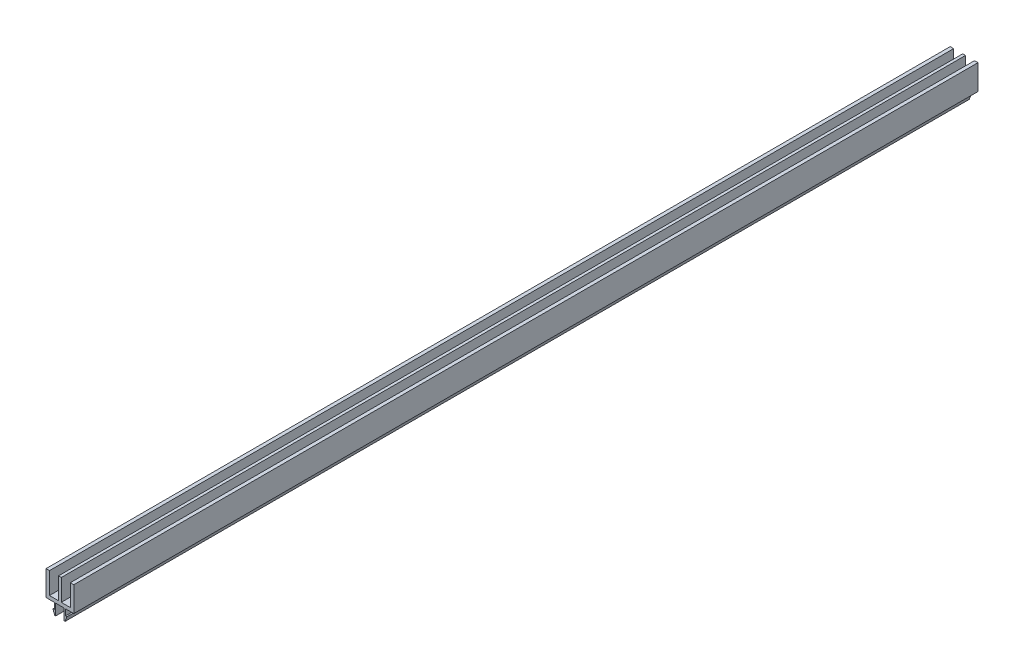
ISO-10303-21;
HEADER;
FILE_DESCRIPTION(('STEP AP214'),'2;1');
FILE_NAME('part.step','',(''),(''),'','','');
FILE_SCHEMA(('AUTOMOTIVE_DESIGN { 1 0 10303 214 1 1 1 1 }'));
ENDSEC;
DATA;
#1=APPLICATION_CONTEXT('core data for automotive mechanical design processes');
#2=APPLICATION_PROTOCOL_DEFINITION('international standard','automotive_design',2000,#1);
#3=PRODUCT_CONTEXT('',#1,'mechanical');
#4=PRODUCT('Part','Part','',(#3));
#5=PRODUCT_RELATED_PRODUCT_CATEGORY('part','',(#4));
#6=PRODUCT_DEFINITION_FORMATION('','',#4);
#7=PRODUCT_DEFINITION_CONTEXT('part definition',#1,'design');
#8=PRODUCT_DEFINITION('design','',#6,#7);
#9=PRODUCT_DEFINITION_SHAPE('','',#8);
#10=(LENGTH_UNIT() NAMED_UNIT(*) SI_UNIT(.MILLI.,.METRE.));
#11=(NAMED_UNIT(*) PLANE_ANGLE_UNIT() SI_UNIT($,.RADIAN.));
#12=(NAMED_UNIT(*) SI_UNIT($,.STERADIAN.) SOLID_ANGLE_UNIT());
#13=UNCERTAINTY_MEASURE_WITH_UNIT(LENGTH_MEASURE(1.E-05),#10,'distance_accuracy_value','');
#14=(GEOMETRIC_REPRESENTATION_CONTEXT(3) GLOBAL_UNCERTAINTY_ASSIGNED_CONTEXT((#13)) GLOBAL_UNIT_ASSIGNED_CONTEXT((#10,
#11,#12)) REPRESENTATION_CONTEXT('',''));
#15=CARTESIAN_POINT('',(0.,0.,0.));
#16=DIRECTION('',(0.,0.,1.));
#17=DIRECTION('',(1.,0.,0.));
#18=AXIS2_PLACEMENT_3D('',#15,#16,#17);
#19=CARTESIAN_POINT('',(-1.,17.9999999975,-600.29));
#20=DIRECTION('',(-1.,0.,0.));
#21=DIRECTION('',(0.,-1.,0.));
#22=AXIS2_PLACEMENT_3D('',#19,#20,#21);
#23=PLANE('',#22);
#24=DIRECTION('',(0.,-1.,0.));
#25=VECTOR('',#24,1.);
#26=CARTESIAN_POINT('',(-1.,17.9999999975,50.));
#27=LINE('',#26,#25);
#28=CARTESIAN_POINT('',(-1.,17.9999999975,50.));
#29=VERTEX_POINT('',#28);
#30=CARTESIAN_POINT('',(-1.,2.4999999995,50.));
#31=VERTEX_POINT('',#30);
#32=EDGE_CURVE('E225',#29,#31,#27,.T.);
#33=ORIENTED_EDGE('',*,*,#32,.F.);
#34=DIRECTION('',(0.,0.,1.));
#35=VECTOR('',#34,1.);
#36=CARTESIAN_POINT('',(-1.,17.9999999975,-600.29));
#37=LINE('',#36,#35);
#38=CARTESIAN_POINT('',(-1.,17.9999999975,-600.29));
#39=VERTEX_POINT('',#38);
#40=EDGE_CURVE('E11',#39,#29,#37,.T.);
#41=ORIENTED_EDGE('',*,*,#40,.F.);
#42=DIRECTION('',(0.,-1.,0.));
#43=VECTOR('',#42,1.);
#44=CARTESIAN_POINT('',(-1.,17.9999999975,-600.29));
#45=LINE('',#44,#43);
#46=CARTESIAN_POINT('',(-1.,2.4999999995,-600.29));
#47=VERTEX_POINT('',#46);
#48=EDGE_CURVE('E293',#39,#47,#45,.T.);
#49=ORIENTED_EDGE('',*,*,#48,.T.);
#50=DIRECTION('',(0.,0.,1.));
#51=VECTOR('',#50,1.);
#52=CARTESIAN_POINT('',(-1.,2.4999999995,-600.29));
#53=LINE('',#52,#51);
#54=EDGE_CURVE('E35',#47,#31,#53,.T.);
#55=ORIENTED_EDGE('',*,*,#54,.T.);
#56=EDGE_LOOP('',(#33,#41,#49,#55));
#57=FACE_BOUND('',#56,.T.);
#58=ADVANCED_FACE('F32',(#57),#23,.T.);
#59=CARTESIAN_POINT('',(0.999999999999998,17.9999999975,-600.29));
#60=DIRECTION('',(0.,1.,0.));
#61=DIRECTION('',(0.,0.,1.));
#62=AXIS2_PLACEMENT_3D('',#59,#60,#61);
#63=PLANE('',#62);
#64=DIRECTION('',(-1.,0.,0.));
#65=VECTOR('',#64,1.);
#66=CARTESIAN_POINT('',(0.999999999999998,17.9999999975,50.));
#67=LINE('',#66,#65);
#68=CARTESIAN_POINT('',(0.999999999999998,17.9999999975,50.));
#69=VERTEX_POINT('',#68);
#70=EDGE_CURVE('E291',#69,#29,#67,.T.);
#71=ORIENTED_EDGE('',*,*,#70,.F.);
#72=DIRECTION('',(0.,0.,1.));
#73=VECTOR('',#72,1.);
#74=CARTESIAN_POINT('',(0.999999999999998,17.9999999975,-600.29));
#75=LINE('',#74,#73);
#76=CARTESIAN_POINT('',(0.999999999999998,17.9999999975,-600.29));
#77=VERTEX_POINT('',#76);
#78=EDGE_CURVE('E41',#77,#69,#75,.T.);
#79=ORIENTED_EDGE('',*,*,#78,.F.);
#80=DIRECTION('',(-1.,0.,0.));
#81=VECTOR('',#80,1.);
#82=CARTESIAN_POINT('',(0.999999999999998,17.9999999975,-600.29));
#83=LINE('',#82,#81);
#84=EDGE_CURVE('E215',#77,#39,#83,.T.);
#85=ORIENTED_EDGE('',*,*,#84,.T.);
#86=ORIENTED_EDGE('',*,*,#40,.T.);
#87=EDGE_LOOP('',(#71,#79,#85,#86));
#88=FACE_BOUND('',#87,.T.);
#89=ADVANCED_FACE('F337',(#88),#63,.T.);
#90=CARTESIAN_POINT('',(0.999999999999998,2.4999999995,-600.29));
#91=DIRECTION('',(1.,0.,0.));
#92=DIRECTION('',(0.,0.,-1.));
#93=AXIS2_PLACEMENT_3D('',#90,#91,#92);
#94=PLANE('',#93);
#95=DIRECTION('',(0.,1.,0.));
#96=VECTOR('',#95,1.);
#97=CARTESIAN_POINT('',(0.999999999999998,2.4999999995,50.));
#98=LINE('',#97,#96);
#99=CARTESIAN_POINT('',(0.999999999999998,2.4999999995,50.));
#100=VERTEX_POINT('',#99);
#101=EDGE_CURVE('E202',#100,#69,#98,.T.);
#102=ORIENTED_EDGE('',*,*,#101,.F.);
#103=DIRECTION('',(0.,0.,1.));
#104=VECTOR('',#103,1.);
#105=CARTESIAN_POINT('',(0.999999999999998,2.4999999995,-600.29));
#106=LINE('',#105,#104);
#107=CARTESIAN_POINT('',(0.999999999999998,2.4999999995,-600.29));
#108=VERTEX_POINT('',#107);
#109=EDGE_CURVE('E197',#108,#100,#106,.T.);
#110=ORIENTED_EDGE('',*,*,#109,.F.);
#111=DIRECTION('',(0.,1.,0.));
#112=VECTOR('',#111,1.);
#113=CARTESIAN_POINT('',(0.999999999999998,2.4999999995,-600.29));
#114=LINE('',#113,#112);
#115=EDGE_CURVE('E200',#108,#77,#114,.T.);
#116=ORIENTED_EDGE('',*,*,#115,.T.);
#117=ORIENTED_EDGE('',*,*,#78,.T.);
#118=EDGE_LOOP('',(#102,#110,#116,#117));
#119=FACE_BOUND('',#118,.T.);
#120=ADVANCED_FACE('F199',(#119),#94,.T.);
#121=CARTESIAN_POINT('',(7.5,2.4999999995,-600.29));
#122=DIRECTION('',(0.,1.,0.));
#123=DIRECTION('',(-1.,0.,0.));
#124=AXIS2_PLACEMENT_3D('',#121,#122,#123);
#125=PLANE('',#124);
#126=DIRECTION('',(-1.,0.,0.));
#127=VECTOR('',#126,1.);
#128=CARTESIAN_POINT('',(7.5,2.4999999995,50.));
#129=LINE('',#128,#127);
#130=CARTESIAN_POINT('',(7.5,2.4999999995,50.));
#131=VERTEX_POINT('',#130);
#132=EDGE_CURVE('E288',#131,#100,#129,.T.);
#133=ORIENTED_EDGE('',*,*,#132,.F.);
#134=DIRECTION('',(0.,0.,1.));
#135=VECTOR('',#134,1.);
#136=CARTESIAN_POINT('',(7.5,2.4999999995,-600.29));
#137=LINE('',#136,#135);
#138=CARTESIAN_POINT('',(7.5,2.4999999995,-600.29));
#139=VERTEX_POINT('',#138);
#140=EDGE_CURVE('E207',#139,#131,#137,.T.);
#141=ORIENTED_EDGE('',*,*,#140,.F.);
#142=DIRECTION('',(-1.,0.,0.));
#143=VECTOR('',#142,1.);
#144=CARTESIAN_POINT('',(7.5,2.4999999995,-600.29));
#145=LINE('',#144,#143);
#146=EDGE_CURVE('E213',#139,#108,#145,.T.);
#147=ORIENTED_EDGE('',*,*,#146,.T.);
#148=ORIENTED_EDGE('',*,*,#109,.T.);
#149=EDGE_LOOP('',(#133,#141,#147,#148));
#150=FACE_BOUND('',#149,.T.);
#151=ADVANCED_FACE('F217',(#150),#125,.T.);
#152=CARTESIAN_POINT('',(7.5,17.9999999975,-600.29));
#153=DIRECTION('',(-1.,0.,0.));
#154=DIRECTION('',(0.,-1.,0.));
#155=AXIS2_PLACEMENT_3D('',#152,#153,#154);
#156=PLANE('',#155);
#157=DIRECTION('',(0.,-1.,0.));
#158=VECTOR('',#157,1.);
#159=CARTESIAN_POINT('',(7.5,17.9999999975,50.));
#160=LINE('',#159,#158);
#161=CARTESIAN_POINT('',(7.5,17.9999999975,50.));
#162=VERTEX_POINT('',#161);
#163=EDGE_CURVE('E285',#162,#131,#160,.T.);
#164=ORIENTED_EDGE('',*,*,#163,.F.);
#165=DIRECTION('',(0.,0.,1.));
#166=VECTOR('',#165,1.);
#167=CARTESIAN_POINT('',(7.5,17.9999999975,-600.29));
#168=LINE('',#167,#166);
#169=CARTESIAN_POINT('',(7.5,17.9999999975,-600.29));
#170=VERTEX_POINT('',#169);
#171=EDGE_CURVE('E297',#170,#162,#168,.T.);
#172=ORIENTED_EDGE('',*,*,#171,.F.);
#173=DIRECTION('',(0.,-1.,0.));
#174=VECTOR('',#173,1.);
#175=CARTESIAN_POINT('',(7.5,17.9999999975,-600.29));
#176=LINE('',#175,#174);
#177=EDGE_CURVE('E218',#170,#139,#176,.T.);
#178=ORIENTED_EDGE('',*,*,#177,.T.);
#179=ORIENTED_EDGE('',*,*,#140,.T.);
#180=EDGE_LOOP('',(#164,#172,#178,#179));
#181=FACE_BOUND('',#180,.T.);
#182=ADVANCED_FACE('F350',(#181),#156,.T.);
#183=CARTESIAN_POINT('',(10.,17.9999999975,-600.29));
#184=DIRECTION('',(0.,1.,0.));
#185=DIRECTION('',(0.,0.,1.));
#186=AXIS2_PLACEMENT_3D('',#183,#184,#185);
#187=PLANE('',#186);
#188=DIRECTION('',(-1.,0.,0.));
#189=VECTOR('',#188,1.);
#190=CARTESIAN_POINT('',(10.,17.9999999975,50.));
#191=LINE('',#190,#189);
#192=CARTESIAN_POINT('',(10.,17.9999999975,50.));
#193=VERTEX_POINT('',#192);
#194=EDGE_CURVE('E282',#193,#162,#191,.T.);
#195=ORIENTED_EDGE('',*,*,#194,.F.);
#196=DIRECTION('',(0.,0.,1.));
#197=VECTOR('',#196,1.);
#198=CARTESIAN_POINT('',(10.,17.9999999975,-600.29));
#199=LINE('',#198,#197);
#200=CARTESIAN_POINT('',(10.,17.9999999975,-600.29));
#201=VERTEX_POINT('',#200);
#202=EDGE_CURVE('E299',#201,#193,#199,.T.);
#203=ORIENTED_EDGE('',*,*,#202,.F.);
#204=DIRECTION('',(-1.,0.,0.));
#205=VECTOR('',#204,1.);
#206=CARTESIAN_POINT('',(10.,17.9999999975,-600.29));
#207=LINE('',#206,#205);
#208=EDGE_CURVE('E220',#201,#170,#207,.T.);
#209=ORIENTED_EDGE('',*,*,#208,.T.);
#210=ORIENTED_EDGE('',*,*,#171,.T.);
#211=EDGE_LOOP('',(#195,#203,#209,#210));
#212=FACE_BOUND('',#211,.T.);
#213=ADVANCED_FACE('F353',(#212),#187,.T.);
#214=CARTESIAN_POINT('',(10.,-4.99999828349541E-10,-600.29));
#215=DIRECTION('',(1.,0.,0.));
#216=DIRECTION('',(0.,0.,-1.));
#217=AXIS2_PLACEMENT_3D('',#214,#215,#216);
#218=PLANE('',#217);
#219=DIRECTION('',(0.,1.,0.));
#220=VECTOR('',#219,1.);
#221=CARTESIAN_POINT('',(10.,-4.99999828349541E-10,50.));
#222=LINE('',#221,#220);
#223=CARTESIAN_POINT('',(10.,-4.99999828349541E-10,50.));
#224=VERTEX_POINT('',#223);
#225=EDGE_CURVE('E279',#224,#193,#222,.T.);
#226=ORIENTED_EDGE('',*,*,#225,.F.);
#227=DIRECTION('',(0.,0.,1.));
#228=VECTOR('',#227,1.);
#229=CARTESIAN_POINT('',(10.,-4.99999828349541E-10,-600.29));
#230=LINE('',#229,#228);
#231=CARTESIAN_POINT('',(10.,-4.99999828349541E-10,-600.29));
#232=VERTEX_POINT('',#231);
#233=EDGE_CURVE('E301',#232,#224,#230,.T.);
#234=ORIENTED_EDGE('',*,*,#233,.F.);
#235=DIRECTION('',(0.,1.,0.));
#236=VECTOR('',#235,1.);
#237=CARTESIAN_POINT('',(10.,-4.99999828349541E-10,-600.29));
#238=LINE('',#237,#236);
#239=EDGE_CURVE('E643',#232,#201,#238,.T.);
#240=ORIENTED_EDGE('',*,*,#239,.T.);
#241=ORIENTED_EDGE('',*,*,#202,.T.);
#242=EDGE_LOOP('',(#226,#234,#240,#241));
#243=FACE_BOUND('',#242,.T.);
#244=ADVANCED_FACE('F357',(#243),#218,.T.);
#245=CARTESIAN_POINT('',(4.,-4.99999998002099E-10,-600.29));
#246=DIRECTION('',(0.,-1.,0.));
#247=DIRECTION('',(1.,0.,0.));
#248=AXIS2_PLACEMENT_3D('',#245,#246,#247);
#249=PLANE('',#248);
#250=DIRECTION('',(1.,0.,0.));
#251=VECTOR('',#250,1.);
#252=CARTESIAN_POINT('',(4.,-4.99999998002099E-10,50.));
#253=LINE('',#252,#251);
#254=CARTESIAN_POINT('',(4.,-4.99999998002099E-10,50.));
#255=VERTEX_POINT('',#254);
#256=EDGE_CURVE('E276',#255,#224,#253,.T.);
#257=ORIENTED_EDGE('',*,*,#256,.F.);
#258=DIRECTION('',(0.,0.,1.));
#259=VECTOR('',#258,1.);
#260=CARTESIAN_POINT('',(4.,-4.99999998002099E-10,-600.29));
#261=LINE('',#260,#259);
#262=CARTESIAN_POINT('',(4.,-4.99999998002099E-10,-600.29));
#263=VERTEX_POINT('',#262);
#264=EDGE_CURVE('E303',#263,#255,#261,.T.);
#265=ORIENTED_EDGE('',*,*,#264,.F.);
#266=DIRECTION('',(1.,0.,0.));
#267=VECTOR('',#266,1.);
#268=CARTESIAN_POINT('',(4.,-4.99999998002099E-10,-600.29));
#269=LINE('',#268,#267);
#270=EDGE_CURVE('E647',#263,#232,#269,.T.);
#271=ORIENTED_EDGE('',*,*,#270,.T.);
#272=ORIENTED_EDGE('',*,*,#233,.T.);
#273=EDGE_LOOP('',(#257,#265,#271,#272));
#274=FACE_BOUND('',#273,.T.);
#275=ADVANCED_FACE('F361',(#274),#249,.T.);
#276=CARTESIAN_POINT('',(4.,-4.5,-600.29));
#277=DIRECTION('',(1.,0.,0.));
#278=DIRECTION('',(0.,0.,-1.));
#279=AXIS2_PLACEMENT_3D('',#276,#277,#278);
#280=PLANE('',#279);
#281=DIRECTION('',(0.,1.,0.));
#282=VECTOR('',#281,1.);
#283=CARTESIAN_POINT('',(4.,-4.5,50.));
#284=LINE('',#283,#282);
#285=CARTESIAN_POINT('',(4.,-4.5,50.));
#286=VERTEX_POINT('',#285);
#287=EDGE_CURVE('E273',#286,#255,#284,.T.);
#288=ORIENTED_EDGE('',*,*,#287,.F.);
#289=DIRECTION('',(0.,0.,1.));
#290=VECTOR('',#289,1.);
#291=CARTESIAN_POINT('',(4.,-4.5,-600.29));
#292=LINE('',#291,#290);
#293=CARTESIAN_POINT('',(4.,-4.5,-600.29));
#294=VERTEX_POINT('',#293);
#295=EDGE_CURVE('E305',#294,#286,#292,.T.);
#296=ORIENTED_EDGE('',*,*,#295,.F.);
#297=DIRECTION('',(0.,1.,0.));
#298=VECTOR('',#297,1.);
#299=CARTESIAN_POINT('',(4.,-4.5,-600.29));
#300=LINE('',#299,#298);
#301=EDGE_CURVE('E636',#294,#263,#300,.T.);
#302=ORIENTED_EDGE('',*,*,#301,.T.);
#303=ORIENTED_EDGE('',*,*,#264,.T.);
#304=EDGE_LOOP('',(#288,#296,#302,#303));
#305=FACE_BOUND('',#304,.T.);
#306=ADVANCED_FACE('F365',(#305),#280,.T.);
#307=CARTESIAN_POINT('',(5.,-4.5,-600.29));
#308=DIRECTION('',(0.,1.,0.));
#309=DIRECTION('',(0.,0.,1.));
#310=AXIS2_PLACEMENT_3D('',#307,#308,#309);
#311=PLANE('',#310);
#312=DIRECTION('',(-1.,0.,0.));
#313=VECTOR('',#312,1.);
#314=CARTESIAN_POINT('',(5.,-4.5,50.));
#315=LINE('',#314,#313);
#316=CARTESIAN_POINT('',(5.,-4.5,50.));
#317=VERTEX_POINT('',#316);
#318=EDGE_CURVE('E270',#317,#286,#315,.T.);
#319=ORIENTED_EDGE('',*,*,#318,.F.);
#320=DIRECTION('',(0.,0.,1.));
#321=VECTOR('',#320,1.);
#322=CARTESIAN_POINT('',(5.,-4.5,-600.29));
#323=LINE('',#322,#321);
#324=CARTESIAN_POINT('',(5.,-4.5,-600.29));
#325=VERTEX_POINT('',#324);
#326=EDGE_CURVE('E307',#325,#317,#323,.T.);
#327=ORIENTED_EDGE('',*,*,#326,.F.);
#328=DIRECTION('',(-1.,0.,0.));
#329=VECTOR('',#328,1.);
#330=CARTESIAN_POINT('',(5.,-4.5,-600.29));
#331=LINE('',#330,#329);
#332=EDGE_CURVE('E632',#325,#294,#331,.T.);
#333=ORIENTED_EDGE('',*,*,#332,.T.);
#334=ORIENTED_EDGE('',*,*,#295,.T.);
#335=EDGE_LOOP('',(#319,#327,#333,#334));
#336=FACE_BOUND('',#335,.T.);
#337=ADVANCED_FACE('F369',(#336),#311,.T.);
#338=CARTESIAN_POINT('',(3.75,-8.,-600.29));
#339=DIRECTION('',(0.941741911594837,-0.336336396998157,0.));
#340=DIRECTION('',(0.336336396998157,0.941741911594837,0.));
#341=AXIS2_PLACEMENT_3D('',#338,#339,#340);
#342=PLANE('',#341);
#343=DIRECTION('',(0.336336396998157,0.941741911594837,0.));
#344=VECTOR('',#343,1.);
#345=CARTESIAN_POINT('',(3.75,-8.,50.));
#346=LINE('',#345,#344);
#347=CARTESIAN_POINT('',(3.75,-8.,50.));
#348=VERTEX_POINT('',#347);
#349=EDGE_CURVE('E267',#348,#317,#346,.T.);
#350=ORIENTED_EDGE('',*,*,#349,.F.);
#351=DIRECTION('',(0.,0.,1.));
#352=VECTOR('',#351,1.);
#353=CARTESIAN_POINT('',(3.75,-8.,-600.29));
#354=LINE('',#353,#352);
#355=CARTESIAN_POINT('',(3.75,-8.,-600.29));
#356=VERTEX_POINT('',#355);
#357=EDGE_CURVE('E309',#356,#348,#354,.T.);
#358=ORIENTED_EDGE('',*,*,#357,.F.);
#359=DIRECTION('',(0.336336396998157,0.941741911594837,0.));
#360=VECTOR('',#359,1.);
#361=CARTESIAN_POINT('',(3.75,-8.,-600.29));
#362=LINE('',#361,#360);
#363=EDGE_CURVE('E653',#356,#325,#362,.T.);
#364=ORIENTED_EDGE('',*,*,#363,.T.);
#365=ORIENTED_EDGE('',*,*,#326,.T.);
#366=EDGE_LOOP('',(#350,#358,#364,#365));
#367=FACE_BOUND('',#366,.T.);
#368=ADVANCED_FACE('F373',(#367),#342,.T.);
#369=CARTESIAN_POINT('',(3.,-8.,-600.29));
#370=DIRECTION('',(0.,-1.,0.));
#371=DIRECTION('',(0.,0.,-1.));
#372=AXIS2_PLACEMENT_3D('',#369,#370,#371);
#373=PLANE('',#372);
#374=DIRECTION('',(1.,0.,0.));
#375=VECTOR('',#374,1.);
#376=CARTESIAN_POINT('',(3.,-8.,50.));
#377=LINE('',#376,#375);
#378=CARTESIAN_POINT('',(3.,-8.,50.));
#379=VERTEX_POINT('',#378);
#380=EDGE_CURVE('E264',#379,#348,#377,.T.);
#381=ORIENTED_EDGE('',*,*,#380,.F.);
#382=DIRECTION('',(0.,0.,1.));
#383=VECTOR('',#382,1.);
#384=CARTESIAN_POINT('',(3.,-8.,-600.29));
#385=LINE('',#384,#383);
#386=CARTESIAN_POINT('',(3.,-8.,-600.29));
#387=VERTEX_POINT('',#386);
#388=EDGE_CURVE('E311',#387,#379,#385,.T.);
#389=ORIENTED_EDGE('',*,*,#388,.F.);
#390=DIRECTION('',(1.,0.,0.));
#391=VECTOR('',#390,1.);
#392=CARTESIAN_POINT('',(3.,-8.,-600.29));
#393=LINE('',#392,#391);
#394=EDGE_CURVE('E625',#387,#356,#393,.T.);
#395=ORIENTED_EDGE('',*,*,#394,.T.);
#396=ORIENTED_EDGE('',*,*,#357,.T.);
#397=EDGE_LOOP('',(#381,#389,#395,#396));
#398=FACE_BOUND('',#397,.T.);
#399=ADVANCED_FACE('F377',(#398),#373,.T.);
#400=CARTESIAN_POINT('',(3.,-4.9999985194348E-10,-600.29));
#401=DIRECTION('',(-1.,0.,0.));
#402=DIRECTION('',(0.,0.,1.));
#403=AXIS2_PLACEMENT_3D('',#400,#401,#402);
#404=PLANE('',#403);
#405=DIRECTION('',(0.,-1.,0.));
#406=VECTOR('',#405,1.);
#407=CARTESIAN_POINT('',(3.,-4.9999985194348E-10,50.));
#408=LINE('',#407,#406);
#409=CARTESIAN_POINT('',(3.,-4.9999985194348E-10,50.));
#410=VERTEX_POINT('',#409);
#411=EDGE_CURVE('E261',#410,#379,#408,.T.);
#412=ORIENTED_EDGE('',*,*,#411,.F.);
#413=DIRECTION('',(0.,0.,1.));
#414=VECTOR('',#413,1.);
#415=CARTESIAN_POINT('',(3.,-4.9999985194348E-10,-600.29));
#416=LINE('',#415,#414);
#417=CARTESIAN_POINT('',(3.,-4.9999985194348E-10,-600.29));
#418=VERTEX_POINT('',#417);
#419=EDGE_CURVE('E313',#418,#410,#416,.T.);
#420=ORIENTED_EDGE('',*,*,#419,.F.);
#421=DIRECTION('',(0.,-1.,0.));
#422=VECTOR('',#421,1.);
#423=CARTESIAN_POINT('',(3.,-4.9999985194348E-10,-600.29));
#424=LINE('',#423,#422);
#425=EDGE_CURVE('E621',#418,#387,#424,.T.);
#426=ORIENTED_EDGE('',*,*,#425,.T.);
#427=ORIENTED_EDGE('',*,*,#388,.T.);
#428=EDGE_LOOP('',(#412,#420,#426,#427));
#429=FACE_BOUND('',#428,.T.);
#430=ADVANCED_FACE('F381',(#429),#404,.T.);
#431=CARTESIAN_POINT('',(-3.,-4.99999455901012E-10,-600.29));
#432=DIRECTION('',(0.,-1.,0.));
#433=DIRECTION('',(1.,0.,0.));
#434=AXIS2_PLACEMENT_3D('',#431,#432,#433);
#435=PLANE('',#434);
#436=DIRECTION('',(1.,0.,0.));
#437=VECTOR('',#436,1.);
#438=CARTESIAN_POINT('',(-3.,-4.99999455901012E-10,50.));
#439=LINE('',#438,#437);
#440=CARTESIAN_POINT('',(-3.,-4.99999455901012E-10,50.));
#441=VERTEX_POINT('',#440);
#442=EDGE_CURVE('E258',#441,#410,#439,.T.);
#443=ORIENTED_EDGE('',*,*,#442,.F.);
#444=DIRECTION('',(0.,0.,1.));
#445=VECTOR('',#444,1.);
#446=CARTESIAN_POINT('',(-3.,-4.99999455901012E-10,-600.29));
#447=LINE('',#446,#445);
#448=CARTESIAN_POINT('',(-3.,-4.99999455901012E-10,-600.29));
#449=VERTEX_POINT('',#448);
#450=EDGE_CURVE('E315',#449,#441,#447,.T.);
#451=ORIENTED_EDGE('',*,*,#450,.F.);
#452=DIRECTION('',(1.,0.,0.));
#453=VECTOR('',#452,1.);
#454=CARTESIAN_POINT('',(-3.,-4.99999455901012E-10,-600.29));
#455=LINE('',#454,#453);
#456=EDGE_CURVE('E657',#449,#418,#455,.T.);
#457=ORIENTED_EDGE('',*,*,#456,.T.);
#458=ORIENTED_EDGE('',*,*,#419,.T.);
#459=EDGE_LOOP('',(#443,#451,#457,#458));
#460=FACE_BOUND('',#459,.T.);
#461=ADVANCED_FACE('F385',(#460),#435,.T.);
#462=CARTESIAN_POINT('',(-3.,-8.,-600.29));
#463=DIRECTION('',(1.,0.,0.));
#464=DIRECTION('',(0.,0.,-1.));
#465=AXIS2_PLACEMENT_3D('',#462,#463,#464);
#466=PLANE('',#465);
#467=DIRECTION('',(0.,1.,0.));
#468=VECTOR('',#467,1.);
#469=CARTESIAN_POINT('',(-3.,-8.,50.));
#470=LINE('',#469,#468);
#471=CARTESIAN_POINT('',(-3.,-8.,50.));
#472=VERTEX_POINT('',#471);
#473=EDGE_CURVE('E255',#472,#441,#470,.T.);
#474=ORIENTED_EDGE('',*,*,#473,.F.);
#475=DIRECTION('',(0.,0.,1.));
#476=VECTOR('',#475,1.);
#477=CARTESIAN_POINT('',(-3.,-8.,-600.29));
#478=LINE('',#477,#476);
#479=CARTESIAN_POINT('',(-3.,-8.,-600.29));
#480=VERTEX_POINT('',#479);
#481=EDGE_CURVE('E317',#480,#472,#478,.T.);
#482=ORIENTED_EDGE('',*,*,#481,.F.);
#483=DIRECTION('',(0.,1.,0.));
#484=VECTOR('',#483,1.);
#485=CARTESIAN_POINT('',(-3.,-8.,-600.29));
#486=LINE('',#485,#484);
#487=EDGE_CURVE('E614',#480,#449,#486,.T.);
#488=ORIENTED_EDGE('',*,*,#487,.T.);
#489=ORIENTED_EDGE('',*,*,#450,.T.);
#490=EDGE_LOOP('',(#474,#482,#488,#489));
#491=FACE_BOUND('',#490,.T.);
#492=ADVANCED_FACE('F389',(#491),#466,.T.);
#493=CARTESIAN_POINT('',(-3.75,-8.,-600.29));
#494=DIRECTION('',(0.,-1.,0.));
#495=DIRECTION('',(0.,0.,-1.));
#496=AXIS2_PLACEMENT_3D('',#493,#494,#495);
#497=PLANE('',#496);
#498=DIRECTION('',(1.,0.,0.));
#499=VECTOR('',#498,1.);
#500=CARTESIAN_POINT('',(-3.75,-8.,50.));
#501=LINE('',#500,#499);
#502=CARTESIAN_POINT('',(-3.75,-8.,50.));
#503=VERTEX_POINT('',#502);
#504=EDGE_CURVE('E252',#503,#472,#501,.T.);
#505=ORIENTED_EDGE('',*,*,#504,.F.);
#506=DIRECTION('',(0.,0.,1.));
#507=VECTOR('',#506,1.);
#508=CARTESIAN_POINT('',(-3.75,-8.,-600.29));
#509=LINE('',#508,#507);
#510=CARTESIAN_POINT('',(-3.75,-8.,-600.29));
#511=VERTEX_POINT('',#510);
#512=EDGE_CURVE('E319',#511,#503,#509,.T.);
#513=ORIENTED_EDGE('',*,*,#512,.F.);
#514=DIRECTION('',(1.,0.,0.));
#515=VECTOR('',#514,1.);
#516=CARTESIAN_POINT('',(-3.75,-8.,-600.29));
#517=LINE('',#516,#515);
#518=EDGE_CURVE('E610',#511,#480,#517,.T.);
#519=ORIENTED_EDGE('',*,*,#518,.T.);
#520=ORIENTED_EDGE('',*,*,#481,.T.);
#521=EDGE_LOOP('',(#505,#513,#519,#520));
#522=FACE_BOUND('',#521,.T.);
#523=ADVANCED_FACE('F393',(#522),#497,.T.);
#524=CARTESIAN_POINT('',(-5.,-4.5,-600.29));
#525=DIRECTION('',(-0.941741911594837,-0.336336396998156,0.));
#526=DIRECTION('',(0.336336396998156,-0.941741911594838,0.));
#527=AXIS2_PLACEMENT_3D('',#524,#525,#526);
#528=PLANE('',#527);
#529=DIRECTION('',(0.336336396998156,-0.941741911594837,0.));
#530=VECTOR('',#529,1.);
#531=CARTESIAN_POINT('',(-5.,-4.5,50.));
#532=LINE('',#531,#530);
#533=CARTESIAN_POINT('',(-5.,-4.5,50.));
#534=VERTEX_POINT('',#533);
#535=EDGE_CURVE('E249',#534,#503,#532,.T.);
#536=ORIENTED_EDGE('',*,*,#535,.F.);
#537=DIRECTION('',(0.,0.,1.));
#538=VECTOR('',#537,1.);
#539=CARTESIAN_POINT('',(-5.,-4.5,-600.29));
#540=LINE('',#539,#538);
#541=CARTESIAN_POINT('',(-5.,-4.5,-600.29));
#542=VERTEX_POINT('',#541);
#543=EDGE_CURVE('E321',#542,#534,#540,.T.);
#544=ORIENTED_EDGE('',*,*,#543,.F.);
#545=DIRECTION('',(0.336336396998156,-0.941741911594837,0.));
#546=VECTOR('',#545,1.);
#547=CARTESIAN_POINT('',(-5.,-4.5,-600.29));
#548=LINE('',#547,#546);
#549=EDGE_CURVE('E661',#542,#511,#548,.T.);
#550=ORIENTED_EDGE('',*,*,#549,.T.);
#551=ORIENTED_EDGE('',*,*,#512,.T.);
#552=EDGE_LOOP('',(#536,#544,#550,#551));
#553=FACE_BOUND('',#552,.T.);
#554=ADVANCED_FACE('F397',(#553),#528,.T.);
#555=CARTESIAN_POINT('',(-4.,-4.5,-600.29));
#556=DIRECTION('',(0.,1.,0.));
#557=DIRECTION('',(0.,0.,1.));
#558=AXIS2_PLACEMENT_3D('',#555,#556,#557);
#559=PLANE('',#558);
#560=DIRECTION('',(-1.,0.,0.));
#561=VECTOR('',#560,1.);
#562=CARTESIAN_POINT('',(-4.,-4.5,50.));
#563=LINE('',#562,#561);
#564=CARTESIAN_POINT('',(-4.,-4.5,50.));
#565=VERTEX_POINT('',#564);
#566=EDGE_CURVE('E246',#565,#534,#563,.T.);
#567=ORIENTED_EDGE('',*,*,#566,.F.);
#568=DIRECTION('',(0.,0.,1.));
#569=VECTOR('',#568,1.);
#570=CARTESIAN_POINT('',(-4.,-4.5,-600.29));
#571=LINE('',#570,#569);
#572=CARTESIAN_POINT('',(-4.,-4.5,-600.29));
#573=VERTEX_POINT('',#572);
#574=EDGE_CURVE('E323',#573,#565,#571,.T.);
#575=ORIENTED_EDGE('',*,*,#574,.F.);
#576=DIRECTION('',(-1.,0.,0.));
#577=VECTOR('',#576,1.);
#578=CARTESIAN_POINT('',(-4.,-4.5,-600.29));
#579=LINE('',#578,#577);
#580=EDGE_CURVE('E603',#573,#542,#579,.T.);
#581=ORIENTED_EDGE('',*,*,#580,.T.);
#582=ORIENTED_EDGE('',*,*,#543,.T.);
#583=EDGE_LOOP('',(#567,#575,#581,#582));
#584=FACE_BOUND('',#583,.T.);
#585=ADVANCED_FACE('F401',(#584),#559,.T.);
#586=CARTESIAN_POINT('',(-4.,-4.9999985194348E-10,-600.29));
#587=DIRECTION('',(-1.,0.,0.));
#588=DIRECTION('',(0.,0.,1.));
#589=AXIS2_PLACEMENT_3D('',#586,#587,#588);
#590=PLANE('',#589);
#591=DIRECTION('',(0.,-1.,0.));
#592=VECTOR('',#591,1.);
#593=CARTESIAN_POINT('',(-4.,-4.9999985194348E-10,50.));
#594=LINE('',#593,#592);
#595=CARTESIAN_POINT('',(-4.,-4.9999985194348E-10,50.));
#596=VERTEX_POINT('',#595);
#597=EDGE_CURVE('E243',#596,#565,#594,.T.);
#598=ORIENTED_EDGE('',*,*,#597,.F.);
#599=DIRECTION('',(0.,0.,1.));
#600=VECTOR('',#599,1.);
#601=CARTESIAN_POINT('',(-4.,-4.9999985194348E-10,-600.29));
#602=LINE('',#601,#600);
#603=CARTESIAN_POINT('',(-4.,-4.9999985194348E-10,-600.29));
#604=VERTEX_POINT('',#603);
#605=EDGE_CURVE('E325',#604,#596,#602,.T.);
#606=ORIENTED_EDGE('',*,*,#605,.F.);
#607=DIRECTION('',(0.,-1.,0.));
#608=VECTOR('',#607,1.);
#609=CARTESIAN_POINT('',(-4.,-4.9999985194348E-10,-600.29));
#610=LINE('',#609,#608);
#611=EDGE_CURVE('E599',#604,#573,#610,.T.);
#612=ORIENTED_EDGE('',*,*,#611,.T.);
#613=ORIENTED_EDGE('',*,*,#574,.T.);
#614=EDGE_LOOP('',(#598,#606,#612,#613));
#615=FACE_BOUND('',#614,.T.);
#616=ADVANCED_FACE('F405',(#615),#590,.T.);
#617=CARTESIAN_POINT('',(-10.,-4.99999719929324E-10,-600.29));
#618=DIRECTION('',(0.,-1.,0.));
#619=DIRECTION('',(1.,0.,0.));
#620=AXIS2_PLACEMENT_3D('',#617,#618,#619);
#621=PLANE('',#620);
#622=DIRECTION('',(1.,0.,0.));
#623=VECTOR('',#622,1.);
#624=CARTESIAN_POINT('',(-10.,-4.99999719929324E-10,50.));
#625=LINE('',#624,#623);
#626=CARTESIAN_POINT('',(-10.,-4.99999719929324E-10,50.));
#627=VERTEX_POINT('',#626);
#628=EDGE_CURVE('E240',#627,#596,#625,.T.);
#629=ORIENTED_EDGE('',*,*,#628,.F.);
#630=DIRECTION('',(0.,0.,1.));
#631=VECTOR('',#630,1.);
#632=CARTESIAN_POINT('',(-10.,-4.99999719929324E-10,-600.29));
#633=LINE('',#632,#631);
#634=CARTESIAN_POINT('',(-10.,-4.99999719929324E-10,-600.29));
#635=VERTEX_POINT('',#634);
#636=EDGE_CURVE('E327',#635,#627,#633,.T.);
#637=ORIENTED_EDGE('',*,*,#636,.F.);
#638=DIRECTION('',(1.,0.,0.));
#639=VECTOR('',#638,1.);
#640=CARTESIAN_POINT('',(-10.,-4.99999719929324E-10,-600.29));
#641=LINE('',#640,#639);
#642=EDGE_CURVE('E665',#635,#604,#641,.T.);
#643=ORIENTED_EDGE('',*,*,#642,.T.);
#644=ORIENTED_EDGE('',*,*,#605,.T.);
#645=EDGE_LOOP('',(#629,#637,#643,#644));
#646=FACE_BOUND('',#645,.T.);
#647=ADVANCED_FACE('F409',(#646),#621,.T.);
#648=CARTESIAN_POINT('',(-10.,17.9999999975,-600.29));
#649=DIRECTION('',(-1.,0.,0.));
#650=DIRECTION('',(0.,-1.,0.));
#651=AXIS2_PLACEMENT_3D('',#648,#649,#650);
#652=PLANE('',#651);
#653=DIRECTION('',(0.,-1.,0.));
#654=VECTOR('',#653,1.);
#655=CARTESIAN_POINT('',(-10.,17.9999999975,50.));
#656=LINE('',#655,#654);
#657=CARTESIAN_POINT('',(-10.,17.9999999975,50.));
#658=VERTEX_POINT('',#657);
#659=EDGE_CURVE('E237',#658,#627,#656,.T.);
#660=ORIENTED_EDGE('',*,*,#659,.F.);
#661=DIRECTION('',(0.,0.,1.));
#662=VECTOR('',#661,1.);
#663=CARTESIAN_POINT('',(-10.,17.9999999975,-600.29));
#664=LINE('',#663,#662);
#665=CARTESIAN_POINT('',(-10.,17.9999999975,-600.29));
#666=VERTEX_POINT('',#665);
#667=EDGE_CURVE('E329',#666,#658,#664,.T.);
#668=ORIENTED_EDGE('',*,*,#667,.F.);
#669=DIRECTION('',(0.,-1.,0.));
#670=VECTOR('',#669,1.);
#671=CARTESIAN_POINT('',(-10.,17.9999999975,-600.29));
#672=LINE('',#671,#670);
#673=EDGE_CURVE('E592',#666,#635,#672,.T.);
#674=ORIENTED_EDGE('',*,*,#673,.T.);
#675=ORIENTED_EDGE('',*,*,#636,.T.);
#676=EDGE_LOOP('',(#660,#668,#674,#675));
#677=FACE_BOUND('',#676,.T.);
#678=ADVANCED_FACE('F413',(#677),#652,.T.);
#679=CARTESIAN_POINT('',(-7.5,17.9999999975,-600.29));
#680=DIRECTION('',(0.,1.,0.));
#681=DIRECTION('',(0.,0.,1.));
#682=AXIS2_PLACEMENT_3D('',#679,#680,#681);
#683=PLANE('',#682);
#684=DIRECTION('',(-1.,0.,0.));
#685=VECTOR('',#684,1.);
#686=CARTESIAN_POINT('',(-7.5,17.9999999975,50.));
#687=LINE('',#686,#685);
#688=CARTESIAN_POINT('',(-7.5,17.9999999975,50.));
#689=VERTEX_POINT('',#688);
#690=EDGE_CURVE('E234',#689,#658,#687,.T.);
#691=ORIENTED_EDGE('',*,*,#690,.F.);
#692=DIRECTION('',(0.,0.,1.));
#693=VECTOR('',#692,1.);
#694=CARTESIAN_POINT('',(-7.5,17.9999999975,-600.29));
#695=LINE('',#694,#693);
#696=CARTESIAN_POINT('',(-7.5,17.9999999975,-600.29));
#697=VERTEX_POINT('',#696);
#698=EDGE_CURVE('E331',#697,#689,#695,.T.);
#699=ORIENTED_EDGE('',*,*,#698,.F.);
#700=DIRECTION('',(-1.,0.,0.));
#701=VECTOR('',#700,1.);
#702=CARTESIAN_POINT('',(-7.5,17.9999999975,-600.29));
#703=LINE('',#702,#701);
#704=EDGE_CURVE('E588',#697,#666,#703,.T.);
#705=ORIENTED_EDGE('',*,*,#704,.T.);
#706=ORIENTED_EDGE('',*,*,#667,.T.);
#707=EDGE_LOOP('',(#691,#699,#705,#706));
#708=FACE_BOUND('',#707,.T.);
#709=ADVANCED_FACE('F417',(#708),#683,.T.);
#710=CARTESIAN_POINT('',(-7.5,2.4999999995,-600.29));
#711=DIRECTION('',(1.,0.,0.));
#712=DIRECTION('',(0.,0.,-1.));
#713=AXIS2_PLACEMENT_3D('',#710,#711,#712);
#714=PLANE('',#713);
#715=DIRECTION('',(0.,1.,0.));
#716=VECTOR('',#715,1.);
#717=CARTESIAN_POINT('',(-7.5,2.4999999995,50.));
#718=LINE('',#717,#716);
#719=CARTESIAN_POINT('',(-7.5,2.4999999995,50.));
#720=VERTEX_POINT('',#719);
#721=EDGE_CURVE('E231',#720,#689,#718,.T.);
#722=ORIENTED_EDGE('',*,*,#721,.F.);
#723=DIRECTION('',(0.,0.,1.));
#724=VECTOR('',#723,1.);
#725=CARTESIAN_POINT('',(-7.5,2.4999999995,-600.29));
#726=LINE('',#725,#724);
#727=CARTESIAN_POINT('',(-7.5,2.4999999995,-600.29));
#728=VERTEX_POINT('',#727);
#729=EDGE_CURVE('E332',#728,#720,#726,.T.);
#730=ORIENTED_EDGE('',*,*,#729,.F.);
#731=DIRECTION('',(0.,1.,0.));
#732=VECTOR('',#731,1.);
#733=CARTESIAN_POINT('',(-7.5,2.4999999995,-600.29));
#734=LINE('',#733,#732);
#735=EDGE_CURVE('E669',#728,#697,#734,.T.);
#736=ORIENTED_EDGE('',*,*,#735,.T.);
#737=ORIENTED_EDGE('',*,*,#698,.T.);
#738=EDGE_LOOP('',(#722,#730,#736,#737));
#739=FACE_BOUND('',#738,.T.);
#740=ADVANCED_FACE('F421',(#739),#714,.T.);
#741=CARTESIAN_POINT('',(-1.,2.4999999995,-600.29));
#742=DIRECTION('',(0.,1.,0.));
#743=DIRECTION('',(-1.,0.,0.));
#744=AXIS2_PLACEMENT_3D('',#741,#742,#743);
#745=PLANE('',#744);
#746=DIRECTION('',(-1.,0.,0.));
#747=VECTOR('',#746,1.);
#748=CARTESIAN_POINT('',(-1.,2.4999999995,50.));
#749=LINE('',#748,#747);
#750=EDGE_CURVE('E228',#31,#720,#749,.T.);
#751=ORIENTED_EDGE('',*,*,#750,.F.);
#752=ORIENTED_EDGE('',*,*,#54,.F.);
#753=DIRECTION('',(-1.,0.,0.));
#754=VECTOR('',#753,1.);
#755=CARTESIAN_POINT('',(-1.,2.4999999995,-600.29));
#756=LINE('',#755,#754);
#757=EDGE_CURVE('E671',#47,#728,#756,.T.);
#758=ORIENTED_EDGE('',*,*,#757,.T.);
#759=ORIENTED_EDGE('',*,*,#729,.T.);
#760=EDGE_LOOP('',(#751,#752,#758,#759));
#761=FACE_BOUND('',#760,.T.);
#762=ADVANCED_FACE('F334',(#761),#745,.T.);
#763=CARTESIAN_POINT('',(0.,0.,-600.29));
#764=DIRECTION('',(0.,0.,-1.));
#765=DIRECTION('',(-1.,0.,0.));
#766=AXIS2_PLACEMENT_3D('',#763,#764,#765);
#767=PLANE('',#766);
#768=ORIENTED_EDGE('',*,*,#48,.F.);
#769=ORIENTED_EDGE('',*,*,#84,.F.);
#770=ORIENTED_EDGE('',*,*,#115,.F.);
#771=ORIENTED_EDGE('',*,*,#146,.F.);
#772=ORIENTED_EDGE('',*,*,#177,.F.);
#773=ORIENTED_EDGE('',*,*,#208,.F.);
#774=ORIENTED_EDGE('',*,*,#239,.F.);
#775=ORIENTED_EDGE('',*,*,#270,.F.);
#776=ORIENTED_EDGE('',*,*,#301,.F.);
#777=ORIENTED_EDGE('',*,*,#332,.F.);
#778=ORIENTED_EDGE('',*,*,#363,.F.);
#779=ORIENTED_EDGE('',*,*,#394,.F.);
#780=ORIENTED_EDGE('',*,*,#425,.F.);
#781=ORIENTED_EDGE('',*,*,#456,.F.);
#782=ORIENTED_EDGE('',*,*,#487,.F.);
#783=ORIENTED_EDGE('',*,*,#518,.F.);
#784=ORIENTED_EDGE('',*,*,#549,.F.);
#785=ORIENTED_EDGE('',*,*,#580,.F.);
#786=ORIENTED_EDGE('',*,*,#611,.F.);
#787=ORIENTED_EDGE('',*,*,#642,.F.);
#788=ORIENTED_EDGE('',*,*,#673,.F.);
#789=ORIENTED_EDGE('',*,*,#704,.F.);
#790=ORIENTED_EDGE('',*,*,#735,.F.);
#791=ORIENTED_EDGE('',*,*,#757,.F.);
#792=EDGE_LOOP('',(#768,#769,#770,#771,#772,#773,#774,#775,#776,#777,#778,#779,#780,#781,#782,
#783,#784,#785,#786,#787,#788,#789,#790,#791));
#793=FACE_BOUND('',#792,.T.);
#794=ADVANCED_FACE('F211',(#793),#767,.T.);
#795=CARTESIAN_POINT('',(0.,0.,50.));
#796=DIRECTION('',(0.,0.,-1.));
#797=DIRECTION('',(-1.,0.,0.));
#798=AXIS2_PLACEMENT_3D('',#795,#796,#797);
#799=PLANE('',#798);
#800=ORIENTED_EDGE('',*,*,#32,.T.);
#801=ORIENTED_EDGE('',*,*,#750,.T.);
#802=ORIENTED_EDGE('',*,*,#721,.T.);
#803=ORIENTED_EDGE('',*,*,#690,.T.);
#804=ORIENTED_EDGE('',*,*,#659,.T.);
#805=ORIENTED_EDGE('',*,*,#628,.T.);
#806=ORIENTED_EDGE('',*,*,#597,.T.);
#807=ORIENTED_EDGE('',*,*,#566,.T.);
#808=ORIENTED_EDGE('',*,*,#535,.T.);
#809=ORIENTED_EDGE('',*,*,#504,.T.);
#810=ORIENTED_EDGE('',*,*,#473,.T.);
#811=ORIENTED_EDGE('',*,*,#442,.T.);
#812=ORIENTED_EDGE('',*,*,#411,.T.);
#813=ORIENTED_EDGE('',*,*,#380,.T.);
#814=ORIENTED_EDGE('',*,*,#349,.T.);
#815=ORIENTED_EDGE('',*,*,#318,.T.);
#816=ORIENTED_EDGE('',*,*,#287,.T.);
#817=ORIENTED_EDGE('',*,*,#256,.T.);
#818=ORIENTED_EDGE('',*,*,#225,.T.);
#819=ORIENTED_EDGE('',*,*,#194,.T.);
#820=ORIENTED_EDGE('',*,*,#163,.T.);
#821=ORIENTED_EDGE('',*,*,#132,.T.);
#822=ORIENTED_EDGE('',*,*,#101,.T.);
#823=ORIENTED_EDGE('',*,*,#70,.T.);
#824=EDGE_LOOP('',(#800,#801,#802,#803,#804,#805,#806,#807,#808,#809,#810,#811,#812,#813,#814,
#815,#816,#817,#818,#819,#820,#821,#822,#823));
#825=FACE_BOUND('',#824,.T.);
#826=ADVANCED_FACE('F336',(#825),#799,.F.);
#827=CLOSED_SHELL('',(#58,#89,#120,#151,#182,#213,#244,#275,#306,#337,#368,#399,#430,#461,#492,
#523,#554,#585,#616,#647,#678,#709,#740,#762,#794,#826));
#828=MANIFOLD_SOLID_BREP('B2',#827);
#829=ADVANCED_BREP_SHAPE_REPRESENTATION('',(#18,#828),#14);
#830=SHAPE_DEFINITION_REPRESENTATION(#9,#829);
ENDSEC;
END-ISO-10303-21;
